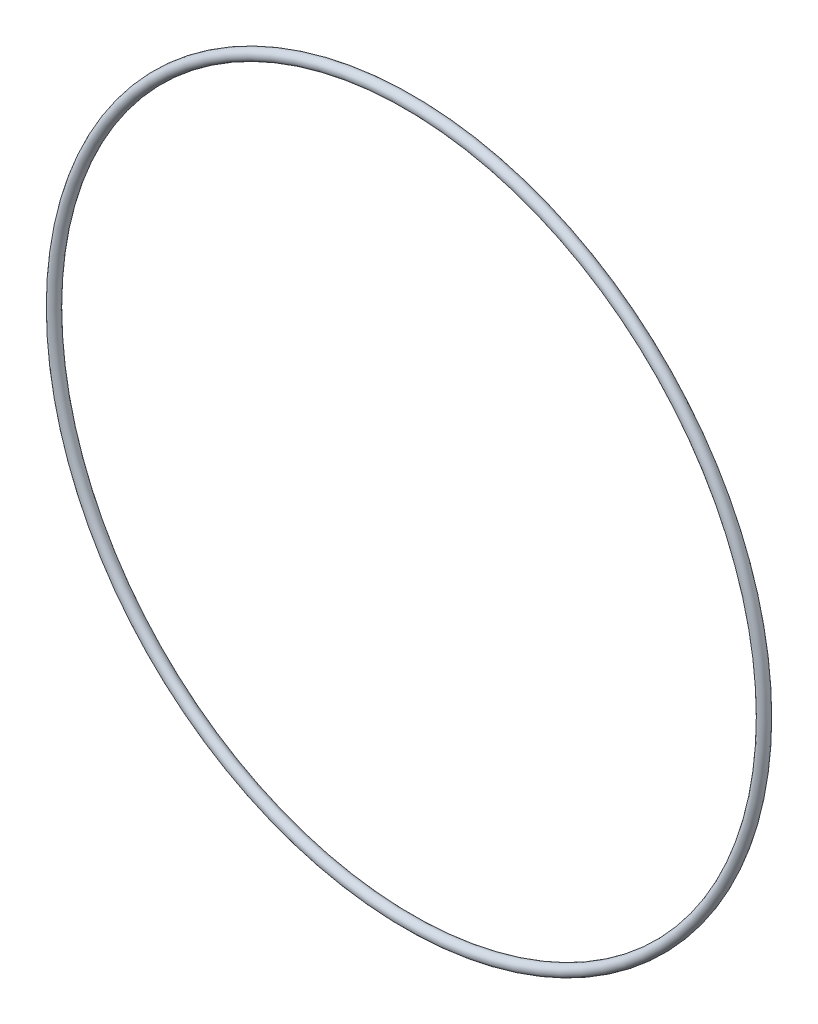
ISO-10303-21;
HEADER;
FILE_DESCRIPTION(('STEP AP214'),'2;1');
FILE_NAME('part.step','',(''),(''),'','','');
FILE_SCHEMA(('AUTOMOTIVE_DESIGN { 1 0 10303 214 1 1 1 1 }'));
ENDSEC;
DATA;
#1=APPLICATION_CONTEXT('core data for automotive mechanical design processes');
#2=APPLICATION_PROTOCOL_DEFINITION('international standard','automotive_design',2000,#1);
#3=PRODUCT_CONTEXT('',#1,'mechanical');
#4=PRODUCT('Part','Part','',(#3));
#5=PRODUCT_RELATED_PRODUCT_CATEGORY('part','',(#4));
#6=PRODUCT_DEFINITION_FORMATION('','',#4);
#7=PRODUCT_DEFINITION_CONTEXT('part definition',#1,'design');
#8=PRODUCT_DEFINITION('design','',#6,#7);
#9=PRODUCT_DEFINITION_SHAPE('','',#8);
#10=(LENGTH_UNIT() NAMED_UNIT(*) SI_UNIT(.MILLI.,.METRE.));
#11=(NAMED_UNIT(*) PLANE_ANGLE_UNIT() SI_UNIT($,.RADIAN.));
#12=(NAMED_UNIT(*) SI_UNIT($,.STERADIAN.) SOLID_ANGLE_UNIT());
#13=UNCERTAINTY_MEASURE_WITH_UNIT(LENGTH_MEASURE(1.E-05),#10,'distance_accuracy_value','');
#14=(GEOMETRIC_REPRESENTATION_CONTEXT(3) GLOBAL_UNCERTAINTY_ASSIGNED_CONTEXT((#13)) GLOBAL_UNIT_ASSIGNED_CONTEXT((#10,
#11,#12)) REPRESENTATION_CONTEXT('',''));
#15=CARTESIAN_POINT('',(0.,0.,0.));
#16=DIRECTION('',(0.,0.,1.));
#17=DIRECTION('',(1.,0.,0.));
#18=AXIS2_PLACEMENT_3D('',#15,#16,#17);
#19=CARTESIAN_POINT('',(0.,0.,0.));
#20=DIRECTION('',(0.,0.,1.));
#21=DIRECTION('',(1.,0.,0.));
#22=AXIS2_PLACEMENT_3D('',#19,#20,#21);
#23=TOROIDAL_SURFACE('',#22,57.8993,0.889000000000003);
#24=CARTESIAN_POINT('',(58.7883,0.,0.));
#25=VERTEX_POINT('',#24);
#26=VERTEX_LOOP('',#25);
#27=FACE_BOUND('',#26,.T.);
#28=ADVANCED_FACE('F33',(#27),#23,.T.);
#29=CLOSED_SHELL('',(#28));
#30=MANIFOLD_SOLID_BREP('B2',#29);
#31=ADVANCED_BREP_SHAPE_REPRESENTATION('',(#18,#30),#14);
#32=SHAPE_DEFINITION_REPRESENTATION(#9,#31);
ENDSEC;
END-ISO-10303-21;
